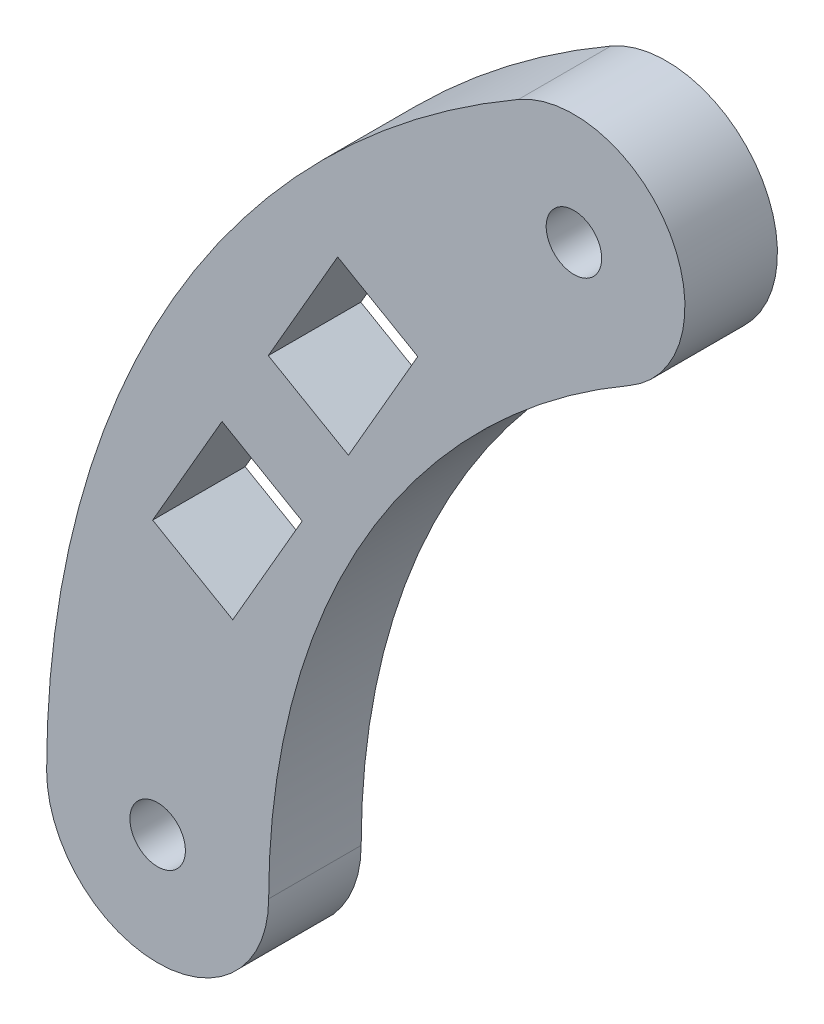
ISO-10303-21;
HEADER;
FILE_DESCRIPTION(('STEP AP214'),'2;1');
FILE_NAME('part.step','',(''),(''),'','','');
FILE_SCHEMA(('AUTOMOTIVE_DESIGN { 1 0 10303 214 1 1 1 1 }'));
ENDSEC;
DATA;
#1=APPLICATION_CONTEXT('core data for automotive mechanical design processes');
#2=APPLICATION_PROTOCOL_DEFINITION('international standard','automotive_design',2000,#1);
#3=PRODUCT_CONTEXT('',#1,'mechanical');
#4=PRODUCT('Part','Part','',(#3));
#5=PRODUCT_RELATED_PRODUCT_CATEGORY('part','',(#4));
#6=PRODUCT_DEFINITION_FORMATION('','',#4);
#7=PRODUCT_DEFINITION_CONTEXT('part definition',#1,'design');
#8=PRODUCT_DEFINITION('design','',#6,#7);
#9=PRODUCT_DEFINITION_SHAPE('','',#8);
#10=(LENGTH_UNIT() NAMED_UNIT(*) SI_UNIT(.MILLI.,.METRE.));
#11=(NAMED_UNIT(*) PLANE_ANGLE_UNIT() SI_UNIT($,.RADIAN.));
#12=(NAMED_UNIT(*) SI_UNIT($,.STERADIAN.) SOLID_ANGLE_UNIT());
#13=UNCERTAINTY_MEASURE_WITH_UNIT(LENGTH_MEASURE(1.E-05),#10,'distance_accuracy_value','');
#14=(GEOMETRIC_REPRESENTATION_CONTEXT(3) GLOBAL_UNCERTAINTY_ASSIGNED_CONTEXT((#13)) GLOBAL_UNIT_ASSIGNED_CONTEXT((#10,
#11,#12)) REPRESENTATION_CONTEXT('',''));
#15=CARTESIAN_POINT('',(0.,0.,0.));
#16=DIRECTION('',(0.,0.,1.));
#17=DIRECTION('',(1.,0.,0.));
#18=AXIS2_PLACEMENT_3D('',#15,#16,#17);
#19=CARTESIAN_POINT('',(-11.25,19.4855715851499,5.));
#20=DIRECTION('',(0.,0.,1.));
#21=DIRECTION('',(1.,0.,0.));
#22=AXIS2_PLACEMENT_3D('',#19,#20,#21);
#23=PLANE('',#22);
#24=DIRECTION('',(-0.499999999999999,-0.866025403784439,0.));
#25=VECTOR('',#24,1.);
#26=CARTESIAN_POINT('',(-39.0201812759764,25.4150635094611,5.));
#27=LINE('',#26,#25);
#28=CARTESIAN_POINT('',(-35.2701812759764,31.9102540378444,5.));
#29=VERTEX_POINT('',#28);
#30=CARTESIAN_POINT('',(-39.0201812759764,25.4150635094611,5.));
#31=VERTEX_POINT('',#30);
#32=EDGE_CURVE('E160',#29,#31,#27,.T.);
#33=ORIENTED_EDGE('',*,*,#32,.F.);
#34=DIRECTION('',(-0.866025403784439,0.5,0.));
#35=VECTOR('',#34,1.);
#36=CARTESIAN_POINT('',(-35.2701812759764,31.9102540378444,5.));
#37=LINE('',#36,#35);
#38=CARTESIAN_POINT('',(-30.9400542570542,29.4102540378444,5.));
#39=VERTEX_POINT('',#38);
#40=EDGE_CURVE('E158',#39,#29,#37,.T.);
#41=ORIENTED_EDGE('',*,*,#40,.F.);
#42=DIRECTION('',(0.500000000000001,0.866025403784438,0.));
#43=VECTOR('',#42,1.);
#44=CARTESIAN_POINT('',(-30.9400542570542,29.4102540378444,5.));
#45=LINE('',#44,#43);
#46=CARTESIAN_POINT('',(-34.6900542570542,22.9150635094611,5.));
#47=VERTEX_POINT('',#46);
#48=EDGE_CURVE('E166',#47,#39,#45,.T.);
#49=ORIENTED_EDGE('',*,*,#48,.F.);
#50=DIRECTION('',(0.866025403784439,-0.5,0.));
#51=VECTOR('',#50,1.);
#52=CARTESIAN_POINT('',(-34.6900542570542,22.9150635094611,5.));
#53=LINE('',#52,#51);
#54=EDGE_CURVE('E163',#31,#47,#53,.T.);
#55=ORIENTED_EDGE('',*,*,#54,.F.);
#56=EDGE_LOOP('',(#33,#41,#49,#55));
#57=FACE_BOUND('',#56,.T.);
#58=CARTESIAN_POINT('',(-22.5,38.9711431702997,5.));
#59=DIRECTION('',(0.,0.,1.));
#60=DIRECTION('',(1.,0.,0.));
#61=AXIS2_PLACEMENT_3D('',#58,#59,#60);
#62=CIRCLE('',#61,1.5);
#63=CARTESIAN_POINT('',(-21.,38.9711431702997,5.));
#64=VERTEX_POINT('',#63);
#65=EDGE_CURVE('E195',#64,#64,#62,.T.);
#66=ORIENTED_EDGE('',*,*,#65,.F.);
#67=EDGE_LOOP('',(#66));
#68=FACE_BOUND('',#67,.T.);
#69=CARTESIAN_POINT('',(-22.5,38.9711431702997,5.));
#70=DIRECTION('',(0.,0.,1.));
#71=DIRECTION('',(1.,0.,0.));
#72=AXIS2_PLACEMENT_3D('',#69,#70,#71);
#73=CIRCLE('',#72,6.);
#74=CARTESIAN_POINT('',(-19.5,33.7749907475931,5.));
#75=VERTEX_POINT('',#74);
#76=CARTESIAN_POINT('',(-25.5,44.1672955930064,5.));
#77=VERTEX_POINT('',#76);
#78=EDGE_CURVE('E201',#75,#77,#73,.T.);
#79=ORIENTED_EDGE('',*,*,#78,.T.);
#80=CARTESIAN_POINT('',(0.,0.,5.));
#81=DIRECTION('',(0.,0.,1.));
#82=DIRECTION('',(1.,0.,0.));
#83=AXIS2_PLACEMENT_3D('',#80,#81,#82);
#84=CIRCLE('',#83,51.);
#85=CARTESIAN_POINT('',(-51.,0.,5.));
#86=VERTEX_POINT('',#85);
#87=EDGE_CURVE('E204',#77,#86,#84,.T.);
#88=ORIENTED_EDGE('',*,*,#87,.T.);
#89=CARTESIAN_POINT('',(-45.,0.,5.));
#90=DIRECTION('',(0.,0.,1.));
#91=DIRECTION('',(1.,0.,0.));
#92=AXIS2_PLACEMENT_3D('',#89,#90,#91);
#93=CIRCLE('',#92,6.00000000000002);
#94=CARTESIAN_POINT('',(-39.,0.,5.));
#95=VERTEX_POINT('',#94);
#96=EDGE_CURVE('E207',#86,#95,#93,.T.);
#97=ORIENTED_EDGE('',*,*,#96,.T.);
#98=CARTESIAN_POINT('',(0.,0.,5.));
#99=DIRECTION('',(0.,0.,-1.));
#100=DIRECTION('',(1.,0.,0.));
#101=AXIS2_PLACEMENT_3D('',#98,#99,#100);
#102=CIRCLE('',#101,39.);
#103=EDGE_CURVE('E209',#95,#75,#102,.T.);
#104=ORIENTED_EDGE('',*,*,#103,.T.);
#105=EDGE_LOOP('',(#79,#88,#97,#104));
#106=FACE_BOUND('',#105,.T.);
#107=CARTESIAN_POINT('',(-45.,0.,5.));
#108=DIRECTION('',(0.,0.,1.));
#109=DIRECTION('',(1.,0.,0.));
#110=AXIS2_PLACEMENT_3D('',#107,#108,#109);
#111=CIRCLE('',#110,1.5);
#112=CARTESIAN_POINT('',(-43.5,0.,5.));
#113=VERTEX_POINT('',#112);
#114=EDGE_CURVE('E189',#113,#113,#111,.T.);
#115=ORIENTED_EDGE('',*,*,#114,.F.);
#116=EDGE_LOOP('',(#115));
#117=FACE_BOUND('',#116,.T.);
#118=DIRECTION('',(0.866025403784439,-0.5,0.));
#119=VECTOR('',#118,1.);
#120=CARTESIAN_POINT('',(-45.2701812759764,14.5897459621556,5.));
#121=LINE('',#120,#119);
#122=CARTESIAN_POINT('',(-45.2701812759764,14.5897459621556,5.));
#123=VERTEX_POINT('',#122);
#124=CARTESIAN_POINT('',(-40.9400542570542,12.0897459621556,5.));
#125=VERTEX_POINT('',#124);
#126=EDGE_CURVE('E130',#123,#125,#121,.T.);
#127=ORIENTED_EDGE('',*,*,#126,.F.);
#128=DIRECTION('',(-0.5,-0.866025403784438,0.));
#129=VECTOR('',#128,1.);
#130=CARTESIAN_POINT('',(-41.5201812759764,21.0849364905389,5.));
#131=LINE('',#130,#129);
#132=CARTESIAN_POINT('',(-41.5201812759764,21.0849364905389,5.));
#133=VERTEX_POINT('',#132);
#134=EDGE_CURVE('E122',#133,#123,#131,.T.);
#135=ORIENTED_EDGE('',*,*,#134,.F.);
#136=DIRECTION('',(-0.866025403784439,0.5,0.));
#137=VECTOR('',#136,1.);
#138=CARTESIAN_POINT('',(-37.1900542570542,18.5849364905389,5.));
#139=LINE('',#138,#137);
#140=CARTESIAN_POINT('',(-37.1900542570542,18.5849364905389,5.));
#141=VERTEX_POINT('',#140);
#142=EDGE_CURVE('E144',#141,#133,#139,.T.);
#143=ORIENTED_EDGE('',*,*,#142,.F.);
#144=DIRECTION('',(0.5,0.866025403784439,0.));
#145=VECTOR('',#144,1.);
#146=CARTESIAN_POINT('',(-40.9400542570542,12.0897459621556,5.));
#147=LINE('',#146,#145);
#148=EDGE_CURVE('E142',#125,#141,#147,.T.);
#149=ORIENTED_EDGE('',*,*,#148,.F.);
#150=EDGE_LOOP('',(#127,#135,#143,#149));
#151=FACE_BOUND('',#150,.T.);
#152=ADVANCED_FACE('F33',(#57,#68,#106,#117,#151),#23,.T.);
#153=CARTESIAN_POINT('',(-11.25,19.4855715851499,0.));
#154=DIRECTION('',(0.,0.,1.));
#155=DIRECTION('',(1.,0.,0.));
#156=AXIS2_PLACEMENT_3D('',#153,#154,#155);
#157=PLANE('',#156);
#158=DIRECTION('',(-0.866025403784439,0.5,0.));
#159=VECTOR('',#158,1.);
#160=CARTESIAN_POINT('',(-35.2701812759764,31.9102540378444,0.));
#161=LINE('',#160,#159);
#162=CARTESIAN_POINT('',(-30.9400542570542,29.4102540378444,0.));
#163=VERTEX_POINT('',#162);
#164=CARTESIAN_POINT('',(-35.2701812759764,31.9102540378444,0.));
#165=VERTEX_POINT('',#164);
#166=EDGE_CURVE('E138',#163,#165,#161,.T.);
#167=ORIENTED_EDGE('',*,*,#166,.T.);
#168=DIRECTION('',(-0.499999999999999,-0.866025403784439,0.));
#169=VECTOR('',#168,1.);
#170=CARTESIAN_POINT('',(-39.0201812759764,25.4150635094611,0.));
#171=LINE('',#170,#169);
#172=CARTESIAN_POINT('',(-39.0201812759764,25.4150635094611,0.));
#173=VERTEX_POINT('',#172);
#174=EDGE_CURVE('E171',#165,#173,#171,.T.);
#175=ORIENTED_EDGE('',*,*,#174,.T.);
#176=DIRECTION('',(0.866025403784439,-0.5,0.));
#177=VECTOR('',#176,1.);
#178=CARTESIAN_POINT('',(-34.6900542570542,22.9150635094611,0.));
#179=LINE('',#178,#177);
#180=CARTESIAN_POINT('',(-34.6900542570542,22.9150635094611,0.));
#181=VERTEX_POINT('',#180);
#182=EDGE_CURVE('E174',#173,#181,#179,.T.);
#183=ORIENTED_EDGE('',*,*,#182,.T.);
#184=DIRECTION('',(0.500000000000001,0.866025403784438,0.));
#185=VECTOR('',#184,1.);
#186=CARTESIAN_POINT('',(-30.9400542570542,29.4102540378444,0.));
#187=LINE('',#186,#185);
#188=EDGE_CURVE('E161',#181,#163,#187,.T.);
#189=ORIENTED_EDGE('',*,*,#188,.T.);
#190=EDGE_LOOP('',(#167,#175,#183,#189));
#191=FACE_BOUND('',#190,.T.);
#192=CARTESIAN_POINT('',(-22.5,38.9711431702997,0.));
#193=DIRECTION('',(0.,0.,1.));
#194=DIRECTION('',(1.,0.,0.));
#195=AXIS2_PLACEMENT_3D('',#192,#193,#194);
#196=CIRCLE('',#195,1.5);
#197=CARTESIAN_POINT('',(-21.,38.9711431702997,0.));
#198=VERTEX_POINT('',#197);
#199=EDGE_CURVE('E192',#198,#198,#196,.T.);
#200=ORIENTED_EDGE('',*,*,#199,.T.);
#201=EDGE_LOOP('',(#200));
#202=FACE_BOUND('',#201,.T.);
#203=CARTESIAN_POINT('',(-22.5,38.9711431702997,0.));
#204=DIRECTION('',(0.,0.,1.));
#205=DIRECTION('',(1.,0.,0.));
#206=AXIS2_PLACEMENT_3D('',#203,#204,#205);
#207=CIRCLE('',#206,6.);
#208=CARTESIAN_POINT('',(-19.5,33.7749907475931,0.));
#209=VERTEX_POINT('',#208);
#210=CARTESIAN_POINT('',(-25.5,44.1672955930064,0.));
#211=VERTEX_POINT('',#210);
#212=EDGE_CURVE('E198',#209,#211,#207,.T.);
#213=ORIENTED_EDGE('',*,*,#212,.F.);
#214=CARTESIAN_POINT('',(0.,0.,0.));
#215=DIRECTION('',(0.,0.,-1.));
#216=DIRECTION('',(1.,0.,0.));
#217=AXIS2_PLACEMENT_3D('',#214,#215,#216);
#218=CIRCLE('',#217,39.);
#219=CARTESIAN_POINT('',(-39.,0.,0.));
#220=VERTEX_POINT('',#219);
#221=EDGE_CURVE('E205',#220,#209,#218,.T.);
#222=ORIENTED_EDGE('',*,*,#221,.F.);
#223=CARTESIAN_POINT('',(-45.,0.,0.));
#224=DIRECTION('',(0.,0.,1.));
#225=DIRECTION('',(1.,0.,0.));
#226=AXIS2_PLACEMENT_3D('',#223,#224,#225);
#227=CIRCLE('',#226,6.00000000000002);
#228=CARTESIAN_POINT('',(-51.,0.,0.));
#229=VERTEX_POINT('',#228);
#230=EDGE_CURVE('E216',#229,#220,#227,.T.);
#231=ORIENTED_EDGE('',*,*,#230,.F.);
#232=CARTESIAN_POINT('',(0.,0.,0.));
#233=DIRECTION('',(0.,0.,1.));
#234=DIRECTION('',(1.,0.,0.));
#235=AXIS2_PLACEMENT_3D('',#232,#233,#234);
#236=CIRCLE('',#235,51.);
#237=EDGE_CURVE('E214',#211,#229,#236,.T.);
#238=ORIENTED_EDGE('',*,*,#237,.F.);
#239=EDGE_LOOP('',(#213,#222,#231,#238));
#240=FACE_BOUND('',#239,.T.);
#241=CARTESIAN_POINT('',(-45.,0.,0.));
#242=DIRECTION('',(0.,0.,1.));
#243=DIRECTION('',(1.,0.,0.));
#244=AXIS2_PLACEMENT_3D('',#241,#242,#243);
#245=CIRCLE('',#244,1.5);
#246=CARTESIAN_POINT('',(-43.5,0.,0.));
#247=VERTEX_POINT('',#246);
#248=EDGE_CURVE('E188',#247,#247,#245,.T.);
#249=ORIENTED_EDGE('',*,*,#248,.T.);
#250=EDGE_LOOP('',(#249));
#251=FACE_BOUND('',#250,.T.);
#252=DIRECTION('',(-0.5,-0.866025403784438,0.));
#253=VECTOR('',#252,1.);
#254=CARTESIAN_POINT('',(-41.5201812759764,21.0849364905389,0.));
#255=LINE('',#254,#253);
#256=CARTESIAN_POINT('',(-41.5201812759764,21.0849364905389,0.));
#257=VERTEX_POINT('',#256);
#258=CARTESIAN_POINT('',(-45.2701812759764,14.5897459621556,0.));
#259=VERTEX_POINT('',#258);
#260=EDGE_CURVE('E56',#257,#259,#255,.T.);
#261=ORIENTED_EDGE('',*,*,#260,.T.);
#262=DIRECTION('',(0.866025403784439,-0.5,0.));
#263=VECTOR('',#262,1.);
#264=CARTESIAN_POINT('',(-45.2701812759764,14.5897459621556,0.));
#265=LINE('',#264,#263);
#266=CARTESIAN_POINT('',(-40.9400542570542,12.0897459621556,0.));
#267=VERTEX_POINT('',#266);
#268=EDGE_CURVE('E137',#259,#267,#265,.T.);
#269=ORIENTED_EDGE('',*,*,#268,.T.);
#270=DIRECTION('',(0.5,0.866025403784439,0.));
#271=VECTOR('',#270,1.);
#272=CARTESIAN_POINT('',(-40.9400542570542,12.0897459621556,0.));
#273=LINE('',#272,#271);
#274=CARTESIAN_POINT('',(-37.1900542570542,18.5849364905389,0.));
#275=VERTEX_POINT('',#274);
#276=EDGE_CURVE('E150',#267,#275,#273,.T.);
#277=ORIENTED_EDGE('',*,*,#276,.T.);
#278=DIRECTION('',(-0.866025403784439,0.5,0.));
#279=VECTOR('',#278,1.);
#280=CARTESIAN_POINT('',(-37.1900542570542,18.5849364905389,0.));
#281=LINE('',#280,#279);
#282=EDGE_CURVE('E131',#275,#257,#281,.T.);
#283=ORIENTED_EDGE('',*,*,#282,.T.);
#284=EDGE_LOOP('',(#261,#269,#277,#283));
#285=FACE_BOUND('',#284,.T.);
#286=ADVANCED_FACE('F234',(#191,#202,#240,#251,#285),#157,.F.);
#287=CARTESIAN_POINT('',(-22.5,38.9711431702997,5.));
#288=DIRECTION('',(0.,0.,-1.));
#289=DIRECTION('',(-1.,0.,0.));
#290=AXIS2_PLACEMENT_3D('',#287,#288,#289);
#291=CYLINDRICAL_SURFACE('',#290,6.);
#292=ORIENTED_EDGE('',*,*,#212,.T.);
#293=DIRECTION('',(0.,0.,-1.));
#294=VECTOR('',#293,1.);
#295=CARTESIAN_POINT('',(-25.5,44.1672955930064,5.));
#296=LINE('',#295,#294);
#297=EDGE_CURVE('E11',#77,#211,#296,.T.);
#298=ORIENTED_EDGE('',*,*,#297,.F.);
#299=ORIENTED_EDGE('',*,*,#78,.F.);
#300=DIRECTION('',(0.,0.,-1.));
#301=VECTOR('',#300,1.);
#302=CARTESIAN_POINT('',(-19.5,33.7749907475931,5.));
#303=LINE('',#302,#301);
#304=EDGE_CURVE('E211',#75,#209,#303,.T.);
#305=ORIENTED_EDGE('',*,*,#304,.T.);
#306=EDGE_LOOP('',(#292,#298,#299,#305));
#307=FACE_BOUND('',#306,.T.);
#308=ADVANCED_FACE('F35',(#307),#291,.T.);
#309=CARTESIAN_POINT('',(0.,0.,5.));
#310=DIRECTION('',(0.,0.,-1.));
#311=DIRECTION('',(-1.,0.,0.));
#312=AXIS2_PLACEMENT_3D('',#309,#310,#311);
#313=CYLINDRICAL_SURFACE('',#312,51.);
#314=ORIENTED_EDGE('',*,*,#237,.T.);
#315=DIRECTION('',(0.,0.,-1.));
#316=VECTOR('',#315,1.);
#317=CARTESIAN_POINT('',(-51.,0.,5.));
#318=LINE('',#317,#316);
#319=EDGE_CURVE('E41',#86,#229,#318,.T.);
#320=ORIENTED_EDGE('',*,*,#319,.F.);
#321=ORIENTED_EDGE('',*,*,#87,.F.);
#322=ORIENTED_EDGE('',*,*,#297,.T.);
#323=EDGE_LOOP('',(#314,#320,#321,#322));
#324=FACE_BOUND('',#323,.T.);
#325=ADVANCED_FACE('F245',(#324),#313,.T.);
#326=CARTESIAN_POINT('',(-45.,0.,5.));
#327=DIRECTION('',(0.,0.,-1.));
#328=DIRECTION('',(-1.,0.,0.));
#329=AXIS2_PLACEMENT_3D('',#326,#327,#328);
#330=CYLINDRICAL_SURFACE('',#329,6.00000000000002);
#331=ORIENTED_EDGE('',*,*,#230,.T.);
#332=DIRECTION('',(0.,0.,-1.));
#333=VECTOR('',#332,1.);
#334=CARTESIAN_POINT('',(-39.,0.,5.));
#335=LINE('',#334,#333);
#336=EDGE_CURVE('E221',#95,#220,#335,.T.);
#337=ORIENTED_EDGE('',*,*,#336,.F.);
#338=ORIENTED_EDGE('',*,*,#96,.F.);
#339=ORIENTED_EDGE('',*,*,#319,.T.);
#340=EDGE_LOOP('',(#331,#337,#338,#339));
#341=FACE_BOUND('',#340,.T.);
#342=ADVANCED_FACE('F228',(#341),#330,.T.);
#343=CARTESIAN_POINT('',(0.,0.,5.));
#344=DIRECTION('',(0.,0.,-1.));
#345=DIRECTION('',(-1.,0.,0.));
#346=AXIS2_PLACEMENT_3D('',#343,#344,#345);
#347=CYLINDRICAL_SURFACE('',#346,39.);
#348=ORIENTED_EDGE('',*,*,#221,.T.);
#349=ORIENTED_EDGE('',*,*,#304,.F.);
#350=ORIENTED_EDGE('',*,*,#103,.F.);
#351=ORIENTED_EDGE('',*,*,#336,.T.);
#352=EDGE_LOOP('',(#348,#349,#350,#351));
#353=FACE_BOUND('',#352,.T.);
#354=ADVANCED_FACE('F238',(#353),#347,.F.);
#355=CARTESIAN_POINT('',(-22.5,38.9711431702997,5.));
#356=DIRECTION('',(0.,0.,-1.));
#357=DIRECTION('',(-1.,0.,0.));
#358=AXIS2_PLACEMENT_3D('',#355,#356,#357);
#359=CYLINDRICAL_SURFACE('',#358,1.5);
#360=ORIENTED_EDGE('',*,*,#65,.T.);
#361=EDGE_LOOP('',(#360));
#362=FACE_BOUND('',#361,.T.);
#363=ORIENTED_EDGE('',*,*,#199,.F.);
#364=EDGE_LOOP('',(#363));
#365=FACE_BOUND('',#364,.T.);
#366=ADVANCED_FACE('F263',(#362,#365),#359,.F.);
#367=CARTESIAN_POINT('',(-45.,0.,5.));
#368=DIRECTION('',(0.,0.,-1.));
#369=DIRECTION('',(-1.,0.,0.));
#370=AXIS2_PLACEMENT_3D('',#367,#368,#369);
#371=CYLINDRICAL_SURFACE('',#370,1.5);
#372=ORIENTED_EDGE('',*,*,#114,.T.);
#373=EDGE_LOOP('',(#372));
#374=FACE_BOUND('',#373,.T.);
#375=ORIENTED_EDGE('',*,*,#248,.F.);
#376=EDGE_LOOP('',(#375));
#377=FACE_BOUND('',#376,.T.);
#378=ADVANCED_FACE('F270',(#374,#377),#371,.F.);
#379=CARTESIAN_POINT('',(-35.2701812759764,31.9102540378444,5.));
#380=DIRECTION('',(-0.5,-0.866025403784439,0.));
#381=DIRECTION('',(0.866025403784439,-0.5,0.));
#382=AXIS2_PLACEMENT_3D('',#379,#380,#381);
#383=PLANE('',#382);
#384=ORIENTED_EDGE('',*,*,#166,.F.);
#385=DIRECTION('',(0.,0.,-1.));
#386=VECTOR('',#385,1.);
#387=CARTESIAN_POINT('',(-30.9400542570542,29.4102540378444,5.));
#388=LINE('',#387,#386);
#389=EDGE_CURVE('E168',#39,#163,#388,.T.);
#390=ORIENTED_EDGE('',*,*,#389,.F.);
#391=ORIENTED_EDGE('',*,*,#40,.T.);
#392=DIRECTION('',(0.,0.,-1.));
#393=VECTOR('',#392,1.);
#394=CARTESIAN_POINT('',(-35.2701812759764,31.9102540378444,5.));
#395=LINE('',#394,#393);
#396=EDGE_CURVE('E185',#29,#165,#395,.T.);
#397=ORIENTED_EDGE('',*,*,#396,.T.);
#398=EDGE_LOOP('',(#384,#390,#391,#397));
#399=FACE_BOUND('',#398,.T.);
#400=ADVANCED_FACE('F275',(#399),#383,.T.);
#401=CARTESIAN_POINT('',(-39.0201812759764,25.4150635094611,5.));
#402=DIRECTION('',(0.866025403784439,-0.5,0.));
#403=DIRECTION('',(0.5,0.866025403784439,0.));
#404=AXIS2_PLACEMENT_3D('',#401,#402,#403);
#405=PLANE('',#404);
#406=ORIENTED_EDGE('',*,*,#174,.F.);
#407=ORIENTED_EDGE('',*,*,#396,.F.);
#408=ORIENTED_EDGE('',*,*,#32,.T.);
#409=DIRECTION('',(0.,0.,-1.));
#410=VECTOR('',#409,1.);
#411=CARTESIAN_POINT('',(-39.0201812759764,25.4150635094611,5.));
#412=LINE('',#411,#410);
#413=EDGE_CURVE('E183',#31,#173,#412,.T.);
#414=ORIENTED_EDGE('',*,*,#413,.T.);
#415=EDGE_LOOP('',(#406,#407,#408,#414));
#416=FACE_BOUND('',#415,.T.);
#417=ADVANCED_FACE('F284',(#416),#405,.T.);
#418=CARTESIAN_POINT('',(-34.6900542570542,22.9150635094611,5.));
#419=DIRECTION('',(0.5,0.866025403784439,0.));
#420=DIRECTION('',(-0.866025403784439,0.5,0.));
#421=AXIS2_PLACEMENT_3D('',#418,#419,#420);
#422=PLANE('',#421);
#423=ORIENTED_EDGE('',*,*,#182,.F.);
#424=ORIENTED_EDGE('',*,*,#413,.F.);
#425=ORIENTED_EDGE('',*,*,#54,.T.);
#426=DIRECTION('',(0.,0.,-1.));
#427=VECTOR('',#426,1.);
#428=CARTESIAN_POINT('',(-34.6900542570542,22.9150635094611,5.));
#429=LINE('',#428,#427);
#430=EDGE_CURVE('E181',#47,#181,#429,.T.);
#431=ORIENTED_EDGE('',*,*,#430,.T.);
#432=EDGE_LOOP('',(#423,#424,#425,#431));
#433=FACE_BOUND('',#432,.T.);
#434=ADVANCED_FACE('F291',(#433),#422,.T.);
#435=CARTESIAN_POINT('',(-30.9400542570542,29.4102540378444,5.));
#436=DIRECTION('',(-0.866025403784438,0.500000000000001,0.));
#437=DIRECTION('',(-0.500000000000001,-0.866025403784438,0.));
#438=AXIS2_PLACEMENT_3D('',#435,#436,#437);
#439=PLANE('',#438);
#440=ORIENTED_EDGE('',*,*,#188,.F.);
#441=ORIENTED_EDGE('',*,*,#430,.F.);
#442=ORIENTED_EDGE('',*,*,#48,.T.);
#443=ORIENTED_EDGE('',*,*,#389,.T.);
#444=EDGE_LOOP('',(#440,#441,#442,#443));
#445=FACE_BOUND('',#444,.T.);
#446=ADVANCED_FACE('F295',(#445),#439,.T.);
#447=CARTESIAN_POINT('',(-41.5201812759764,21.0849364905389,5.));
#448=DIRECTION('',(0.866025403784438,-0.5,0.));
#449=DIRECTION('',(0.500000000000001,0.866025403784438,0.));
#450=AXIS2_PLACEMENT_3D('',#447,#448,#449);
#451=PLANE('',#450);
#452=ORIENTED_EDGE('',*,*,#260,.F.);
#453=DIRECTION('',(0.,0.,-1.));
#454=VECTOR('',#453,1.);
#455=CARTESIAN_POINT('',(-41.5201812759764,21.0849364905389,5.));
#456=LINE('',#455,#454);
#457=EDGE_CURVE('E126',#133,#257,#456,.T.);
#458=ORIENTED_EDGE('',*,*,#457,.F.);
#459=ORIENTED_EDGE('',*,*,#134,.T.);
#460=DIRECTION('',(0.,0.,-1.));
#461=VECTOR('',#460,1.);
#462=CARTESIAN_POINT('',(-45.2701812759764,14.5897459621556,5.));
#463=LINE('',#462,#461);
#464=EDGE_CURVE('E125',#123,#259,#463,.T.);
#465=ORIENTED_EDGE('',*,*,#464,.T.);
#466=EDGE_LOOP('',(#452,#458,#459,#465));
#467=FACE_BOUND('',#466,.T.);
#468=ADVANCED_FACE('F124',(#467),#451,.T.);
#469=CARTESIAN_POINT('',(-45.2701812759764,14.5897459621556,5.));
#470=DIRECTION('',(0.5,0.866025403784439,0.));
#471=DIRECTION('',(-0.866025403784439,0.5,0.));
#472=AXIS2_PLACEMENT_3D('',#469,#470,#471);
#473=PLANE('',#472);
#474=ORIENTED_EDGE('',*,*,#268,.F.);
#475=ORIENTED_EDGE('',*,*,#464,.F.);
#476=ORIENTED_EDGE('',*,*,#126,.T.);
#477=DIRECTION('',(0.,0.,-1.));
#478=VECTOR('',#477,1.);
#479=CARTESIAN_POINT('',(-40.9400542570542,12.0897459621556,5.));
#480=LINE('',#479,#478);
#481=EDGE_CURVE('E139',#125,#267,#480,.T.);
#482=ORIENTED_EDGE('',*,*,#481,.T.);
#483=EDGE_LOOP('',(#474,#475,#476,#482));
#484=FACE_BOUND('',#483,.T.);
#485=ADVANCED_FACE('F134',(#484),#473,.T.);
#486=CARTESIAN_POINT('',(-40.9400542570542,12.0897459621556,5.));
#487=DIRECTION('',(-0.866025403784439,0.5,0.));
#488=DIRECTION('',(-0.5,-0.866025403784439,0.));
#489=AXIS2_PLACEMENT_3D('',#486,#487,#488);
#490=PLANE('',#489);
#491=ORIENTED_EDGE('',*,*,#276,.F.);
#492=ORIENTED_EDGE('',*,*,#481,.F.);
#493=ORIENTED_EDGE('',*,*,#148,.T.);
#494=DIRECTION('',(0.,0.,-1.));
#495=VECTOR('',#494,1.);
#496=CARTESIAN_POINT('',(-37.1900542570542,18.5849364905389,5.));
#497=LINE('',#496,#495);
#498=EDGE_CURVE('E48',#141,#275,#497,.T.);
#499=ORIENTED_EDGE('',*,*,#498,.T.);
#500=EDGE_LOOP('',(#491,#492,#493,#499));
#501=FACE_BOUND('',#500,.T.);
#502=ADVANCED_FACE('F304',(#501),#490,.T.);
#503=CARTESIAN_POINT('',(-37.1900542570542,18.5849364905389,5.));
#504=DIRECTION('',(-0.5,-0.866025403784439,0.));
#505=DIRECTION('',(0.866025403784439,-0.5,0.));
#506=AXIS2_PLACEMENT_3D('',#503,#504,#505);
#507=PLANE('',#506);
#508=ORIENTED_EDGE('',*,*,#282,.F.);
#509=ORIENTED_EDGE('',*,*,#498,.F.);
#510=ORIENTED_EDGE('',*,*,#142,.T.);
#511=ORIENTED_EDGE('',*,*,#457,.T.);
#512=EDGE_LOOP('',(#508,#509,#510,#511));
#513=FACE_BOUND('',#512,.T.);
#514=ADVANCED_FACE('F307',(#513),#507,.T.);
#515=CLOSED_SHELL('',(#152,#286,#308,#325,#342,#354,#366,#378,#400,#417,#434,#446,#468,#485,
#502,#514));
#516=MANIFOLD_SOLID_BREP('B2',#515);
#517=ADVANCED_BREP_SHAPE_REPRESENTATION('',(#18,#516),#14);
#518=SHAPE_DEFINITION_REPRESENTATION(#9,#517);
ENDSEC;
END-ISO-10303-21;
